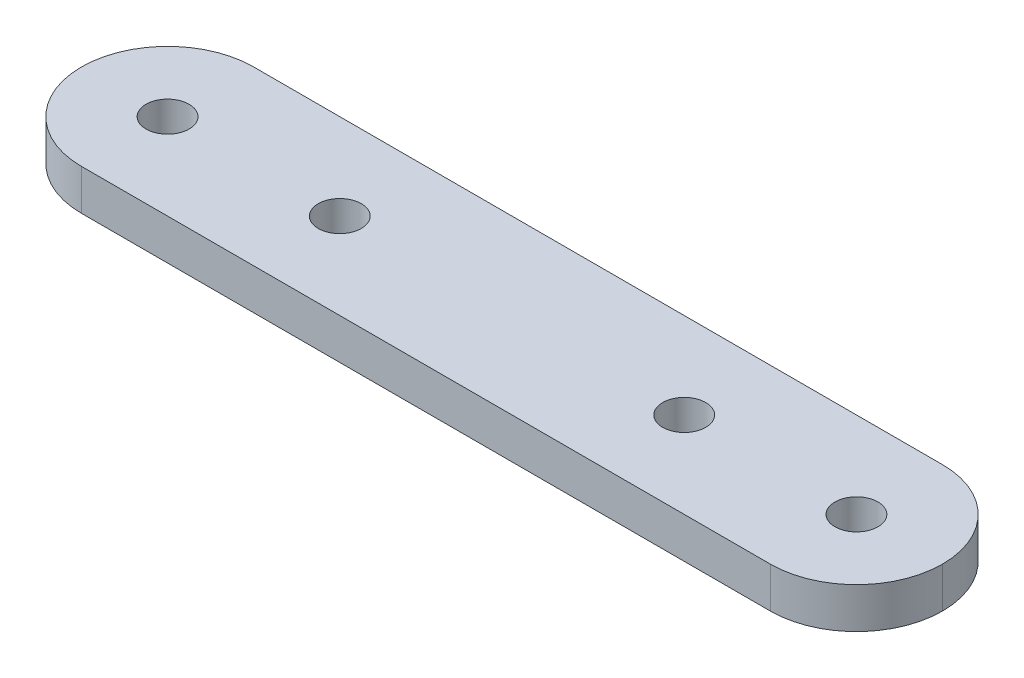
ISO-10303-21;
HEADER;
FILE_DESCRIPTION(('STEP AP214'),'2;1');
FILE_NAME('part.step','',(''),(''),'','','');
FILE_SCHEMA(('AUTOMOTIVE_DESIGN { 1 0 10303 214 1 1 1 1 }'));
ENDSEC;
DATA;
#1=APPLICATION_CONTEXT('core data for automotive mechanical design processes');
#2=APPLICATION_PROTOCOL_DEFINITION('international standard','automotive_design',2000,#1);
#3=PRODUCT_CONTEXT('',#1,'mechanical');
#4=PRODUCT('Part','Part','',(#3));
#5=PRODUCT_RELATED_PRODUCT_CATEGORY('part','',(#4));
#6=PRODUCT_DEFINITION_FORMATION('','',#4);
#7=PRODUCT_DEFINITION_CONTEXT('part definition',#1,'design');
#8=PRODUCT_DEFINITION('design','',#6,#7);
#9=PRODUCT_DEFINITION_SHAPE('','',#8);
#10=(LENGTH_UNIT() NAMED_UNIT(*) SI_UNIT(.MILLI.,.METRE.));
#11=(NAMED_UNIT(*) PLANE_ANGLE_UNIT() SI_UNIT($,.RADIAN.));
#12=(NAMED_UNIT(*) SI_UNIT($,.STERADIAN.) SOLID_ANGLE_UNIT());
#13=UNCERTAINTY_MEASURE_WITH_UNIT(LENGTH_MEASURE(1.E-05),#10,'distance_accuracy_value','');
#14=(GEOMETRIC_REPRESENTATION_CONTEXT(3) GLOBAL_UNCERTAINTY_ASSIGNED_CONTEXT((#13)) GLOBAL_UNIT_ASSIGNED_CONTEXT((#10,
#11,#12)) REPRESENTATION_CONTEXT('',''));
#15=CARTESIAN_POINT('',(0.,0.,0.));
#16=DIRECTION('',(0.,0.,1.));
#17=DIRECTION('',(1.,0.,0.));
#18=AXIS2_PLACEMENT_3D('',#15,#16,#17);
#19=CARTESIAN_POINT('',(0.,3.,0.));
#20=DIRECTION('',(0.,-1.,0.));
#21=DIRECTION('',(0.,0.,-1.));
#22=AXIS2_PLACEMENT_3D('',#19,#20,#21);
#23=PLANE('',#22);
#24=DIRECTION('',(-1.,0.,0.));
#25=VECTOR('',#24,1.);
#26=CARTESIAN_POINT('',(-31.75,3.,-6.35));
#27=LINE('',#26,#25);
#28=CARTESIAN_POINT('',(25.4,3.,-6.35));
#29=VERTEX_POINT('',#28);
#30=CARTESIAN_POINT('',(-25.4,3.,-6.35));
#31=VERTEX_POINT('',#30);
#32=EDGE_CURVE('E161',#29,#31,#27,.T.);
#33=ORIENTED_EDGE('',*,*,#32,.T.);
#34=CARTESIAN_POINT('',(-25.4,3.,0.));
#35=DIRECTION('',(0.,-1.,0.));
#36=DIRECTION('',(0.,0.,-1.));
#37=AXIS2_PLACEMENT_3D('',#34,#35,#36);
#38=CIRCLE('',#37,6.35);
#39=CARTESIAN_POINT('',(-31.75,3.,0.));
#40=VERTEX_POINT('',#39);
#41=EDGE_CURVE('E136',#31,#40,#38,.F.);
#42=ORIENTED_EDGE('',*,*,#41,.T.);
#43=CARTESIAN_POINT('',(-25.4,3.,0.));
#44=DIRECTION('',(0.,-1.,0.));
#45=DIRECTION('',(0.,0.,-1.));
#46=AXIS2_PLACEMENT_3D('',#43,#44,#45);
#47=CIRCLE('',#46,6.35);
#48=CARTESIAN_POINT('',(-25.4,3.,6.35));
#49=VERTEX_POINT('',#48);
#50=EDGE_CURVE('E67',#40,#49,#47,.F.);
#51=ORIENTED_EDGE('',*,*,#50,.T.);
#52=DIRECTION('',(1.,0.,0.));
#53=VECTOR('',#52,1.);
#54=CARTESIAN_POINT('',(-31.75,3.,6.35));
#55=LINE('',#54,#53);
#56=CARTESIAN_POINT('',(25.4,3.,6.35));
#57=VERTEX_POINT('',#56);
#58=EDGE_CURVE('E117',#49,#57,#55,.T.);
#59=ORIENTED_EDGE('',*,*,#58,.T.);
#60=CARTESIAN_POINT('',(25.4,3.,0.));
#61=DIRECTION('',(0.,-1.,0.));
#62=DIRECTION('',(0.,0.,-1.));
#63=AXIS2_PLACEMENT_3D('',#60,#61,#62);
#64=CIRCLE('',#63,6.35);
#65=CARTESIAN_POINT('',(31.75,3.,0.));
#66=VERTEX_POINT('',#65);
#67=EDGE_CURVE('E143',#57,#66,#64,.F.);
#68=ORIENTED_EDGE('',*,*,#67,.T.);
#69=CARTESIAN_POINT('',(25.4,3.,0.));
#70=DIRECTION('',(0.,-1.,0.));
#71=DIRECTION('',(0.,0.,-1.));
#72=AXIS2_PLACEMENT_3D('',#69,#70,#71);
#73=CIRCLE('',#72,6.35);
#74=EDGE_CURVE('E120',#66,#29,#73,.F.);
#75=ORIENTED_EDGE('',*,*,#74,.T.);
#76=EDGE_LOOP('',(#33,#42,#51,#59,#68,#75));
#77=FACE_BOUND('',#76,.T.);
#78=CARTESIAN_POINT('',(-12.7,3.,0.));
#79=DIRECTION('',(0.,1.,0.));
#80=DIRECTION('',(0.,0.,1.));
#81=AXIS2_PLACEMENT_3D('',#78,#79,#80);
#82=CIRCLE('',#81,1.5875);
#83=CARTESIAN_POINT('',(-12.7,3.,1.5875));
#84=VERTEX_POINT('',#83);
#85=EDGE_CURVE('E164',#84,#84,#82,.T.);
#86=ORIENTED_EDGE('',*,*,#85,.F.);
#87=EDGE_LOOP('',(#86));
#88=FACE_BOUND('',#87,.T.);
#89=CARTESIAN_POINT('',(12.7,3.,0.));
#90=DIRECTION('',(0.,1.,0.));
#91=DIRECTION('',(0.,0.,1.));
#92=AXIS2_PLACEMENT_3D('',#89,#90,#91);
#93=CIRCLE('',#92,1.5875);
#94=CARTESIAN_POINT('',(12.7,3.,1.5875));
#95=VERTEX_POINT('',#94);
#96=EDGE_CURVE('E174',#95,#95,#93,.T.);
#97=ORIENTED_EDGE('',*,*,#96,.F.);
#98=EDGE_LOOP('',(#97));
#99=FACE_BOUND('',#98,.T.);
#100=CARTESIAN_POINT('',(25.4,3.,0.));
#101=DIRECTION('',(0.,1.,0.));
#102=DIRECTION('',(0.,0.,1.));
#103=AXIS2_PLACEMENT_3D('',#100,#101,#102);
#104=CIRCLE('',#103,1.5875);
#105=CARTESIAN_POINT('',(25.4,3.,1.5875));
#106=VERTEX_POINT('',#105);
#107=EDGE_CURVE('E182',#106,#106,#104,.T.);
#108=ORIENTED_EDGE('',*,*,#107,.F.);
#109=EDGE_LOOP('',(#108));
#110=FACE_BOUND('',#109,.T.);
#111=CARTESIAN_POINT('',(-25.4,3.,0.));
#112=DIRECTION('',(0.,1.,0.));
#113=DIRECTION('',(0.,0.,1.));
#114=AXIS2_PLACEMENT_3D('',#111,#112,#113);
#115=CIRCLE('',#114,1.5875);
#116=CARTESIAN_POINT('',(-25.4,3.,1.5875));
#117=VERTEX_POINT('',#116);
#118=EDGE_CURVE('E131',#117,#117,#115,.T.);
#119=ORIENTED_EDGE('',*,*,#118,.F.);
#120=EDGE_LOOP('',(#119));
#121=FACE_BOUND('',#120,.T.);
#122=ADVANCED_FACE('F43',(#77,#88,#99,#110,#121),#23,.F.);
#123=CARTESIAN_POINT('',(0.,0.,0.));
#124=DIRECTION('',(0.,-1.,0.));
#125=DIRECTION('',(0.,0.,-1.));
#126=AXIS2_PLACEMENT_3D('',#123,#124,#125);
#127=PLANE('',#126);
#128=CARTESIAN_POINT('',(25.4,0.,0.));
#129=DIRECTION('',(0.,1.,0.));
#130=DIRECTION('',(0.,0.,1.));
#131=AXIS2_PLACEMENT_3D('',#128,#129,#130);
#132=CIRCLE('',#131,1.5875);
#133=CARTESIAN_POINT('',(25.4,0.,1.5875));
#134=VERTEX_POINT('',#133);
#135=EDGE_CURVE('E186',#134,#134,#132,.T.);
#136=ORIENTED_EDGE('',*,*,#135,.T.);
#137=EDGE_LOOP('',(#136));
#138=FACE_BOUND('',#137,.T.);
#139=CARTESIAN_POINT('',(-12.7,0.,0.));
#140=DIRECTION('',(0.,1.,0.));
#141=DIRECTION('',(0.,0.,1.));
#142=AXIS2_PLACEMENT_3D('',#139,#140,#141);
#143=CIRCLE('',#142,1.5875);
#144=CARTESIAN_POINT('',(-12.7,0.,1.5875));
#145=VERTEX_POINT('',#144);
#146=EDGE_CURVE('E170',#145,#145,#143,.T.);
#147=ORIENTED_EDGE('',*,*,#146,.T.);
#148=EDGE_LOOP('',(#147));
#149=FACE_BOUND('',#148,.T.);
#150=CARTESIAN_POINT('',(-25.4,0.,0.));
#151=DIRECTION('',(0.,-1.,0.));
#152=DIRECTION('',(0.,0.,-1.));
#153=AXIS2_PLACEMENT_3D('',#150,#151,#152);
#154=CIRCLE('',#153,6.35);
#155=CARTESIAN_POINT('',(-25.4,0.,6.35));
#156=VERTEX_POINT('',#155);
#157=CARTESIAN_POINT('',(-31.75,0.,0.));
#158=VERTEX_POINT('',#157);
#159=EDGE_CURVE('E110',#156,#158,#154,.T.);
#160=ORIENTED_EDGE('',*,*,#159,.T.);
#161=CARTESIAN_POINT('',(-25.4,0.,0.));
#162=DIRECTION('',(0.,-1.,0.));
#163=DIRECTION('',(0.,0.,-1.));
#164=AXIS2_PLACEMENT_3D('',#161,#162,#163);
#165=CIRCLE('',#164,6.35);
#166=CARTESIAN_POINT('',(-25.4,0.,-6.35));
#167=VERTEX_POINT('',#166);
#168=EDGE_CURVE('E153',#158,#167,#165,.T.);
#169=ORIENTED_EDGE('',*,*,#168,.T.);
#170=DIRECTION('',(-1.,0.,0.));
#171=VECTOR('',#170,1.);
#172=CARTESIAN_POINT('',(-31.75,0.,-6.35));
#173=LINE('',#172,#171);
#174=CARTESIAN_POINT('',(25.4,0.,-6.35));
#175=VERTEX_POINT('',#174);
#176=EDGE_CURVE('E104',#175,#167,#173,.T.);
#177=ORIENTED_EDGE('',*,*,#176,.F.);
#178=CARTESIAN_POINT('',(25.4,0.,0.));
#179=DIRECTION('',(0.,-1.,0.));
#180=DIRECTION('',(0.,0.,-1.));
#181=AXIS2_PLACEMENT_3D('',#178,#179,#180);
#182=CIRCLE('',#181,6.35);
#183=CARTESIAN_POINT('',(31.75,0.,0.));
#184=VERTEX_POINT('',#183);
#185=EDGE_CURVE('E97',#175,#184,#182,.T.);
#186=ORIENTED_EDGE('',*,*,#185,.T.);
#187=CARTESIAN_POINT('',(25.4,0.,0.));
#188=DIRECTION('',(0.,-1.,0.));
#189=DIRECTION('',(0.,0.,-1.));
#190=AXIS2_PLACEMENT_3D('',#187,#188,#189);
#191=CIRCLE('',#190,6.35);
#192=CARTESIAN_POINT('',(25.4,0.,6.35));
#193=VERTEX_POINT('',#192);
#194=EDGE_CURVE('E102',#184,#193,#191,.T.);
#195=ORIENTED_EDGE('',*,*,#194,.T.);
#196=DIRECTION('',(1.,0.,0.));
#197=VECTOR('',#196,1.);
#198=CARTESIAN_POINT('',(-31.75,0.,6.35));
#199=LINE('',#198,#197);
#200=EDGE_CURVE('E158',#156,#193,#199,.T.);
#201=ORIENTED_EDGE('',*,*,#200,.F.);
#202=EDGE_LOOP('',(#160,#169,#177,#186,#195,#201));
#203=FACE_BOUND('',#202,.T.);
#204=CARTESIAN_POINT('',(12.7,0.,0.));
#205=DIRECTION('',(0.,1.,0.));
#206=DIRECTION('',(0.,0.,1.));
#207=AXIS2_PLACEMENT_3D('',#204,#205,#206);
#208=CIRCLE('',#207,1.5875);
#209=CARTESIAN_POINT('',(12.7,0.,1.5875));
#210=VERTEX_POINT('',#209);
#211=EDGE_CURVE('E178',#210,#210,#208,.T.);
#212=ORIENTED_EDGE('',*,*,#211,.T.);
#213=EDGE_LOOP('',(#212));
#214=FACE_BOUND('',#213,.T.);
#215=CARTESIAN_POINT('',(-25.4,0.,0.));
#216=DIRECTION('',(0.,1.,0.));
#217=DIRECTION('',(0.,0.,1.));
#218=AXIS2_PLACEMENT_3D('',#215,#216,#217);
#219=CIRCLE('',#218,1.5875);
#220=CARTESIAN_POINT('',(-25.4,0.,1.5875));
#221=VERTEX_POINT('',#220);
#222=EDGE_CURVE('E125',#221,#221,#219,.T.);
#223=ORIENTED_EDGE('',*,*,#222,.T.);
#224=EDGE_LOOP('',(#223));
#225=FACE_BOUND('',#224,.T.);
#226=ADVANCED_FACE('F99',(#138,#149,#203,#214,#225),#127,.T.);
#227=CARTESIAN_POINT('',(-31.75,3.,-6.35));
#228=DIRECTION('',(0.,0.,1.));
#229=DIRECTION('',(1.,0.,0.));
#230=AXIS2_PLACEMENT_3D('',#227,#228,#229);
#231=PLANE('',#230);
#232=ORIENTED_EDGE('',*,*,#176,.T.);
#233=DIRECTION('',(0.,-1.,0.));
#234=VECTOR('',#233,1.);
#235=CARTESIAN_POINT('',(-25.4,3.,-6.35));
#236=LINE('',#235,#234);
#237=EDGE_CURVE('E146',#167,#31,#236,.F.);
#238=ORIENTED_EDGE('',*,*,#237,.T.);
#239=ORIENTED_EDGE('',*,*,#32,.F.);
#240=DIRECTION('',(0.,-1.,0.));
#241=VECTOR('',#240,1.);
#242=CARTESIAN_POINT('',(25.4,3.,-6.35));
#243=LINE('',#242,#241);
#244=EDGE_CURVE('E150',#29,#175,#243,.T.);
#245=ORIENTED_EDGE('',*,*,#244,.T.);
#246=EDGE_LOOP('',(#232,#238,#239,#245));
#247=FACE_BOUND('',#246,.T.);
#248=ADVANCED_FACE('F205',(#247),#231,.F.);
#249=CARTESIAN_POINT('',(-31.75,3.,6.35));
#250=DIRECTION('',(0.,0.,-1.));
#251=DIRECTION('',(-1.,0.,0.));
#252=AXIS2_PLACEMENT_3D('',#249,#250,#251);
#253=PLANE('',#252);
#254=ORIENTED_EDGE('',*,*,#58,.F.);
#255=DIRECTION('',(0.,-1.,0.));
#256=VECTOR('',#255,1.);
#257=CARTESIAN_POINT('',(-25.4,3.,6.35));
#258=LINE('',#257,#256);
#259=EDGE_CURVE('E11',#49,#156,#258,.T.);
#260=ORIENTED_EDGE('',*,*,#259,.T.);
#261=ORIENTED_EDGE('',*,*,#200,.T.);
#262=DIRECTION('',(0.,-1.,0.));
#263=VECTOR('',#262,1.);
#264=CARTESIAN_POINT('',(25.4,3.,6.35));
#265=LINE('',#264,#263);
#266=EDGE_CURVE('E53',#193,#57,#265,.F.);
#267=ORIENTED_EDGE('',*,*,#266,.T.);
#268=EDGE_LOOP('',(#254,#260,#261,#267));
#269=FACE_BOUND('',#268,.T.);
#270=ADVANCED_FACE('F213',(#269),#253,.F.);
#271=CARTESIAN_POINT('',(-12.7,3.,0.));
#272=DIRECTION('',(0.,-1.,0.));
#273=DIRECTION('',(0.,0.,-1.));
#274=AXIS2_PLACEMENT_3D('',#271,#272,#273);
#275=CYLINDRICAL_SURFACE('',#274,1.5875);
#276=ORIENTED_EDGE('',*,*,#85,.T.);
#277=EDGE_LOOP('',(#276));
#278=FACE_BOUND('',#277,.T.);
#279=ORIENTED_EDGE('',*,*,#146,.F.);
#280=EDGE_LOOP('',(#279));
#281=FACE_BOUND('',#280,.T.);
#282=ADVANCED_FACE('F210',(#278,#281),#275,.F.);
#283=CARTESIAN_POINT('',(12.7,3.,0.));
#284=DIRECTION('',(0.,-1.,0.));
#285=DIRECTION('',(0.,0.,-1.));
#286=AXIS2_PLACEMENT_3D('',#283,#284,#285);
#287=CYLINDRICAL_SURFACE('',#286,1.5875);
#288=ORIENTED_EDGE('',*,*,#96,.T.);
#289=EDGE_LOOP('',(#288));
#290=FACE_BOUND('',#289,.T.);
#291=ORIENTED_EDGE('',*,*,#211,.F.);
#292=EDGE_LOOP('',(#291));
#293=FACE_BOUND('',#292,.T.);
#294=ADVANCED_FACE('F253',(#290,#293),#287,.F.);
#295=CARTESIAN_POINT('',(25.4,3.,0.));
#296=DIRECTION('',(0.,-1.,0.));
#297=DIRECTION('',(0.,0.,-1.));
#298=AXIS2_PLACEMENT_3D('',#295,#296,#297);
#299=CYLINDRICAL_SURFACE('',#298,1.5875);
#300=ORIENTED_EDGE('',*,*,#107,.T.);
#301=EDGE_LOOP('',(#300));
#302=FACE_BOUND('',#301,.T.);
#303=ORIENTED_EDGE('',*,*,#135,.F.);
#304=EDGE_LOOP('',(#303));
#305=FACE_BOUND('',#304,.T.);
#306=ADVANCED_FACE('F246',(#302,#305),#299,.F.);
#307=CARTESIAN_POINT('',(-25.4,3.,0.));
#308=DIRECTION('',(0.,-1.,0.));
#309=DIRECTION('',(0.,0.,-1.));
#310=AXIS2_PLACEMENT_3D('',#307,#308,#309);
#311=CYLINDRICAL_SURFACE('',#310,1.5875);
#312=ORIENTED_EDGE('',*,*,#118,.T.);
#313=EDGE_LOOP('',(#312));
#314=FACE_BOUND('',#313,.T.);
#315=ORIENTED_EDGE('',*,*,#222,.F.);
#316=EDGE_LOOP('',(#315));
#317=FACE_BOUND('',#316,.T.);
#318=ADVANCED_FACE('F197',(#314,#317),#311,.F.);
#319=CARTESIAN_POINT('',(-25.4,3.,0.));
#320=DIRECTION('',(0.,-1.,0.));
#321=DIRECTION('',(0.,0.,-1.));
#322=AXIS2_PLACEMENT_3D('',#319,#320,#321);
#323=CYLINDRICAL_SURFACE('',#322,6.35);
#324=ORIENTED_EDGE('',*,*,#259,.F.);
#325=ORIENTED_EDGE('',*,*,#50,.F.);
#326=DIRECTION('',(0.,-1.,0.));
#327=VECTOR('',#326,1.);
#328=CARTESIAN_POINT('',(-31.75,3.,0.));
#329=LINE('',#328,#327);
#330=EDGE_CURVE('E122',#158,#40,#329,.F.);
#331=ORIENTED_EDGE('',*,*,#330,.F.);
#332=ORIENTED_EDGE('',*,*,#159,.F.);
#333=EDGE_LOOP('',(#324,#325,#331,#332));
#334=FACE_BOUND('',#333,.T.);
#335=ADVANCED_FACE('F222',(#334),#323,.T.);
#336=CARTESIAN_POINT('',(-25.4,3.,0.));
#337=DIRECTION('',(0.,-1.,0.));
#338=DIRECTION('',(0.,0.,-1.));
#339=AXIS2_PLACEMENT_3D('',#336,#337,#338);
#340=CYLINDRICAL_SURFACE('',#339,6.35);
#341=ORIENTED_EDGE('',*,*,#41,.F.);
#342=ORIENTED_EDGE('',*,*,#237,.F.);
#343=ORIENTED_EDGE('',*,*,#168,.F.);
#344=ORIENTED_EDGE('',*,*,#330,.T.);
#345=EDGE_LOOP('',(#341,#342,#343,#344));
#346=FACE_BOUND('',#345,.T.);
#347=ADVANCED_FACE('F219',(#346),#340,.T.);
#348=CARTESIAN_POINT('',(25.4,3.,0.));
#349=DIRECTION('',(0.,-1.,0.));
#350=DIRECTION('',(0.,0.,-1.));
#351=AXIS2_PLACEMENT_3D('',#348,#349,#350);
#352=CYLINDRICAL_SURFACE('',#351,6.35);
#353=DIRECTION('',(0.,-1.,0.));
#354=VECTOR('',#353,1.);
#355=CARTESIAN_POINT('',(31.75,3.,0.));
#356=LINE('',#355,#354);
#357=EDGE_CURVE('E47',#66,#184,#356,.T.);
#358=ORIENTED_EDGE('',*,*,#357,.F.);
#359=ORIENTED_EDGE('',*,*,#67,.F.);
#360=ORIENTED_EDGE('',*,*,#266,.F.);
#361=ORIENTED_EDGE('',*,*,#194,.F.);
#362=EDGE_LOOP('',(#358,#359,#360,#361));
#363=FACE_BOUND('',#362,.T.);
#364=ADVANCED_FACE('F45',(#363),#352,.T.);
#365=CARTESIAN_POINT('',(25.4,3.,0.));
#366=DIRECTION('',(0.,-1.,0.));
#367=DIRECTION('',(0.,0.,-1.));
#368=AXIS2_PLACEMENT_3D('',#365,#366,#367);
#369=CYLINDRICAL_SURFACE('',#368,6.35);
#370=ORIENTED_EDGE('',*,*,#74,.F.);
#371=ORIENTED_EDGE('',*,*,#357,.T.);
#372=ORIENTED_EDGE('',*,*,#185,.F.);
#373=ORIENTED_EDGE('',*,*,#244,.F.);
#374=EDGE_LOOP('',(#370,#371,#372,#373));
#375=FACE_BOUND('',#374,.T.);
#376=ADVANCED_FACE('F119',(#375),#369,.T.);
#377=CLOSED_SHELL('',(#122,#226,#248,#270,#282,#294,#306,#318,#335,#347,#364,#376));
#378=MANIFOLD_SOLID_BREP('B2',#377);
#379=ADVANCED_BREP_SHAPE_REPRESENTATION('',(#18,#378),#14);
#380=SHAPE_DEFINITION_REPRESENTATION(#9,#379);
ENDSEC;
END-ISO-10303-21;
